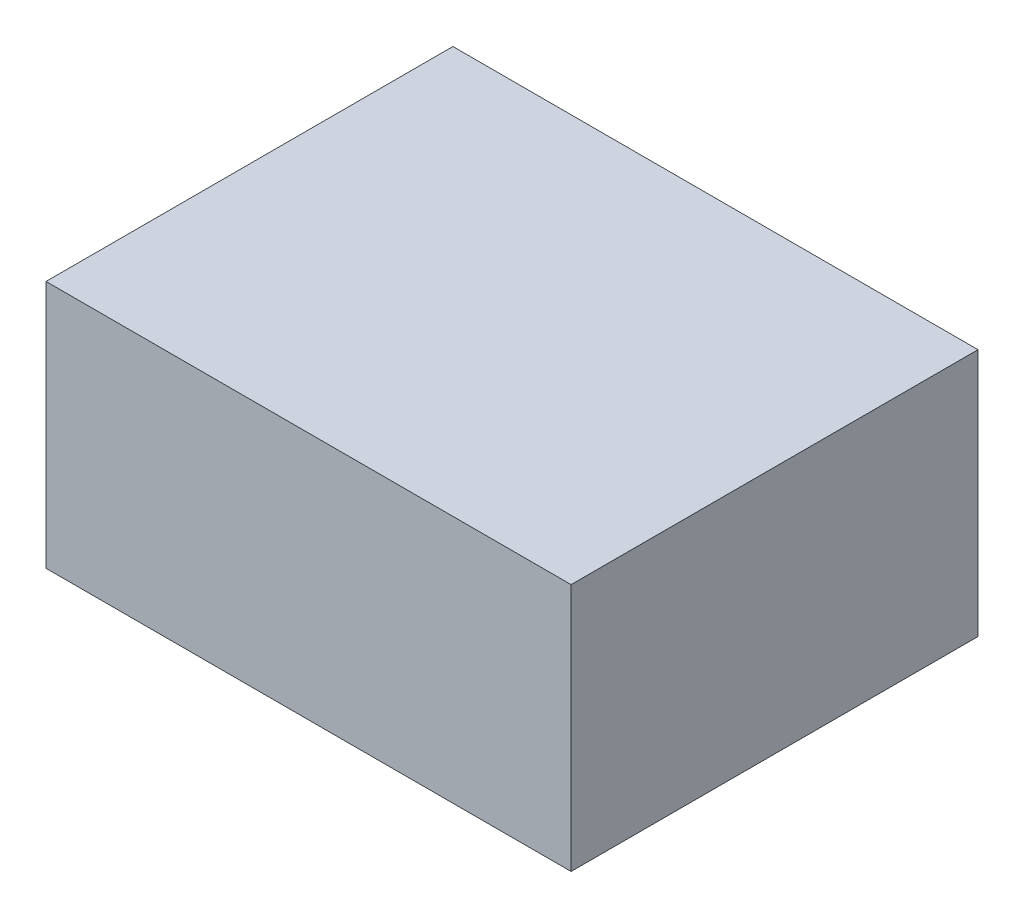
ISO-10303-21;
HEADER;
FILE_DESCRIPTION(('STEP AP214'),'2;1');
FILE_NAME('part.step','',(''),(''),'','','');
FILE_SCHEMA(('AUTOMOTIVE_DESIGN { 1 0 10303 214 1 1 1 1 }'));
ENDSEC;
DATA;
#1=APPLICATION_CONTEXT('core data for automotive mechanical design processes');
#2=APPLICATION_PROTOCOL_DEFINITION('international standard','automotive_design',2000,#1);
#3=PRODUCT_CONTEXT('',#1,'mechanical');
#4=PRODUCT('Part','Part','',(#3));
#5=PRODUCT_RELATED_PRODUCT_CATEGORY('part','',(#4));
#6=PRODUCT_DEFINITION_FORMATION('','',#4);
#7=PRODUCT_DEFINITION_CONTEXT('part definition',#1,'design');
#8=PRODUCT_DEFINITION('design','',#6,#7);
#9=PRODUCT_DEFINITION_SHAPE('','',#8);
#10=(LENGTH_UNIT() NAMED_UNIT(*) SI_UNIT(.MILLI.,.METRE.));
#11=(NAMED_UNIT(*) PLANE_ANGLE_UNIT() SI_UNIT($,.RADIAN.));
#12=(NAMED_UNIT(*) SI_UNIT($,.STERADIAN.) SOLID_ANGLE_UNIT());
#13=UNCERTAINTY_MEASURE_WITH_UNIT(LENGTH_MEASURE(1.E-05),#10,'distance_accuracy_value','');
#14=(GEOMETRIC_REPRESENTATION_CONTEXT(3) GLOBAL_UNCERTAINTY_ASSIGNED_CONTEXT((#13)) GLOBAL_UNIT_ASSIGNED_CONTEXT((#10,
#11,#12)) REPRESENTATION_CONTEXT('',''));
#15=CARTESIAN_POINT('',(0.,0.,0.));
#16=DIRECTION('',(0.,0.,1.));
#17=DIRECTION('',(1.,0.,0.));
#18=AXIS2_PLACEMENT_3D('',#15,#16,#17);
#19=CARTESIAN_POINT('',(-195.5,92.5,303.));
#20=DIRECTION('',(1.,0.,0.));
#21=DIRECTION('',(0.,1.,0.));
#22=AXIS2_PLACEMENT_3D('',#19,#20,#21);
#23=PLANE('',#22);
#24=DIRECTION('',(0.,-1.,0.));
#25=VECTOR('',#24,1.);
#26=CARTESIAN_POINT('',(-195.5,92.5,0.));
#27=LINE('',#26,#25);
#28=CARTESIAN_POINT('',(-195.5,92.5,0.));
#29=VERTEX_POINT('',#28);
#30=CARTESIAN_POINT('',(-195.5,-92.5,0.));
#31=VERTEX_POINT('',#30);
#32=EDGE_CURVE('E96',#29,#31,#27,.T.);
#33=ORIENTED_EDGE('',*,*,#32,.T.);
#34=DIRECTION('',(0.,0.,-1.));
#35=VECTOR('',#34,1.);
#36=CARTESIAN_POINT('',(-195.5,-92.5,303.));
#37=LINE('',#36,#35);
#38=CARTESIAN_POINT('',(-195.5,-92.5,303.));
#39=VERTEX_POINT('',#38);
#40=EDGE_CURVE('E11',#39,#31,#37,.T.);
#41=ORIENTED_EDGE('',*,*,#40,.F.);
#42=DIRECTION('',(0.,-1.,0.));
#43=VECTOR('',#42,1.);
#44=CARTESIAN_POINT('',(-195.5,92.5,303.));
#45=LINE('',#44,#43);
#46=CARTESIAN_POINT('',(-195.5,92.5,303.));
#47=VERTEX_POINT('',#46);
#48=EDGE_CURVE('E84',#47,#39,#45,.T.);
#49=ORIENTED_EDGE('',*,*,#48,.F.);
#50=DIRECTION('',(0.,0.,-1.));
#51=VECTOR('',#50,1.);
#52=CARTESIAN_POINT('',(-195.5,92.5,303.));
#53=LINE('',#52,#51);
#54=EDGE_CURVE('E92',#47,#29,#53,.T.);
#55=ORIENTED_EDGE('',*,*,#54,.T.);
#56=EDGE_LOOP('',(#33,#41,#49,#55));
#57=FACE_BOUND('',#56,.T.);
#58=ADVANCED_FACE('F33',(#57),#23,.F.);
#59=CARTESIAN_POINT('',(195.5,-92.4999999999999,303.));
#60=DIRECTION('',(0.,1.,0.));
#61=DIRECTION('',(-1.,0.,0.));
#62=AXIS2_PLACEMENT_3D('',#59,#60,#61);
#63=PLANE('',#62);
#64=DIRECTION('',(1.,0.,0.));
#65=VECTOR('',#64,1.);
#66=CARTESIAN_POINT('',(195.5,-92.4999999999999,0.));
#67=LINE('',#66,#65);
#68=CARTESIAN_POINT('',(195.5,-92.4999999999999,0.));
#69=VERTEX_POINT('',#68);
#70=EDGE_CURVE('E88',#31,#69,#67,.T.);
#71=ORIENTED_EDGE('',*,*,#70,.T.);
#72=DIRECTION('',(0.,0.,-1.));
#73=VECTOR('',#72,1.);
#74=CARTESIAN_POINT('',(195.5,-92.4999999999999,303.));
#75=LINE('',#74,#73);
#76=CARTESIAN_POINT('',(195.5,-92.4999999999999,303.));
#77=VERTEX_POINT('',#76);
#78=EDGE_CURVE('E41',#77,#69,#75,.T.);
#79=ORIENTED_EDGE('',*,*,#78,.F.);
#80=DIRECTION('',(1.,0.,0.));
#81=VECTOR('',#80,1.);
#82=CARTESIAN_POINT('',(195.5,-92.4999999999999,303.));
#83=LINE('',#82,#81);
#84=EDGE_CURVE('E79',#39,#77,#83,.T.);
#85=ORIENTED_EDGE('',*,*,#84,.F.);
#86=ORIENTED_EDGE('',*,*,#40,.T.);
#87=EDGE_LOOP('',(#71,#79,#85,#86));
#88=FACE_BOUND('',#87,.T.);
#89=ADVANCED_FACE('F87',(#88),#63,.F.);
#90=CARTESIAN_POINT('',(195.5,92.5000000000001,303.));
#91=DIRECTION('',(-1.,0.,0.));
#92=DIRECTION('',(0.,-1.,0.));
#93=AXIS2_PLACEMENT_3D('',#90,#91,#92);
#94=PLANE('',#93);
#95=DIRECTION('',(0.,1.,0.));
#96=VECTOR('',#95,1.);
#97=CARTESIAN_POINT('',(195.5,92.5000000000001,0.));
#98=LINE('',#97,#96);
#99=CARTESIAN_POINT('',(195.5,92.5000000000001,0.));
#100=VERTEX_POINT('',#99);
#101=EDGE_CURVE('E66',#69,#100,#98,.T.);
#102=ORIENTED_EDGE('',*,*,#101,.T.);
#103=DIRECTION('',(0.,0.,-1.));
#104=VECTOR('',#103,1.);
#105=CARTESIAN_POINT('',(195.5,92.5000000000001,303.));
#106=LINE('',#105,#104);
#107=CARTESIAN_POINT('',(195.5,92.5000000000001,303.));
#108=VERTEX_POINT('',#107);
#109=EDGE_CURVE('E89',#108,#100,#106,.T.);
#110=ORIENTED_EDGE('',*,*,#109,.F.);
#111=DIRECTION('',(0.,1.,0.));
#112=VECTOR('',#111,1.);
#113=CARTESIAN_POINT('',(195.5,92.5000000000001,303.));
#114=LINE('',#113,#112);
#115=EDGE_CURVE('E82',#77,#108,#114,.T.);
#116=ORIENTED_EDGE('',*,*,#115,.F.);
#117=ORIENTED_EDGE('',*,*,#78,.T.);
#118=EDGE_LOOP('',(#102,#110,#116,#117));
#119=FACE_BOUND('',#118,.T.);
#120=ADVANCED_FACE('F90',(#119),#94,.F.);
#121=CARTESIAN_POINT('',(195.5,92.5000000000001,303.));
#122=DIRECTION('',(0.,-1.,0.));
#123=DIRECTION('',(1.,0.,0.));
#124=AXIS2_PLACEMENT_3D('',#121,#122,#123);
#125=PLANE('',#124);
#126=DIRECTION('',(-1.,0.,0.));
#127=VECTOR('',#126,1.);
#128=CARTESIAN_POINT('',(195.5,92.5000000000001,0.));
#129=LINE('',#128,#127);
#130=EDGE_CURVE('E72',#100,#29,#129,.T.);
#131=ORIENTED_EDGE('',*,*,#130,.T.);
#132=ORIENTED_EDGE('',*,*,#54,.F.);
#133=DIRECTION('',(-1.,0.,0.));
#134=VECTOR('',#133,1.);
#135=CARTESIAN_POINT('',(195.5,92.5000000000001,303.));
#136=LINE('',#135,#134);
#137=EDGE_CURVE('E49',#108,#47,#136,.T.);
#138=ORIENTED_EDGE('',*,*,#137,.F.);
#139=ORIENTED_EDGE('',*,*,#109,.T.);
#140=EDGE_LOOP('',(#131,#132,#138,#139));
#141=FACE_BOUND('',#140,.T.);
#142=ADVANCED_FACE('F103',(#141),#125,.F.);
#143=CARTESIAN_POINT('',(0.,0.,303.));
#144=DIRECTION('',(0.,0.,-1.));
#145=DIRECTION('',(-1.,0.,0.));
#146=AXIS2_PLACEMENT_3D('',#143,#144,#145);
#147=PLANE('',#146);
#148=ORIENTED_EDGE('',*,*,#48,.T.);
#149=ORIENTED_EDGE('',*,*,#84,.T.);
#150=ORIENTED_EDGE('',*,*,#115,.T.);
#151=ORIENTED_EDGE('',*,*,#137,.T.);
#152=EDGE_LOOP('',(#148,#149,#150,#151));
#153=FACE_BOUND('',#152,.T.);
#154=ADVANCED_FACE('F80',(#153),#147,.F.);
#155=CARTESIAN_POINT('',(0.,0.,0.));
#156=DIRECTION('',(0.,0.,-1.));
#157=DIRECTION('',(-1.,0.,0.));
#158=AXIS2_PLACEMENT_3D('',#155,#156,#157);
#159=PLANE('',#158);
#160=ORIENTED_EDGE('',*,*,#32,.F.);
#161=ORIENTED_EDGE('',*,*,#130,.F.);
#162=ORIENTED_EDGE('',*,*,#101,.F.);
#163=ORIENTED_EDGE('',*,*,#70,.F.);
#164=EDGE_LOOP('',(#160,#161,#162,#163));
#165=FACE_BOUND('',#164,.T.);
#166=ADVANCED_FACE('F106',(#165),#159,.T.);
#167=CLOSED_SHELL('',(#58,#89,#120,#142,#154,#166));
#168=MANIFOLD_SOLID_BREP('B2',#167);
#169=ADVANCED_BREP_SHAPE_REPRESENTATION('',(#18,#168),#14);
#170=SHAPE_DEFINITION_REPRESENTATION(#9,#169);
ENDSEC;
END-ISO-10303-21;
